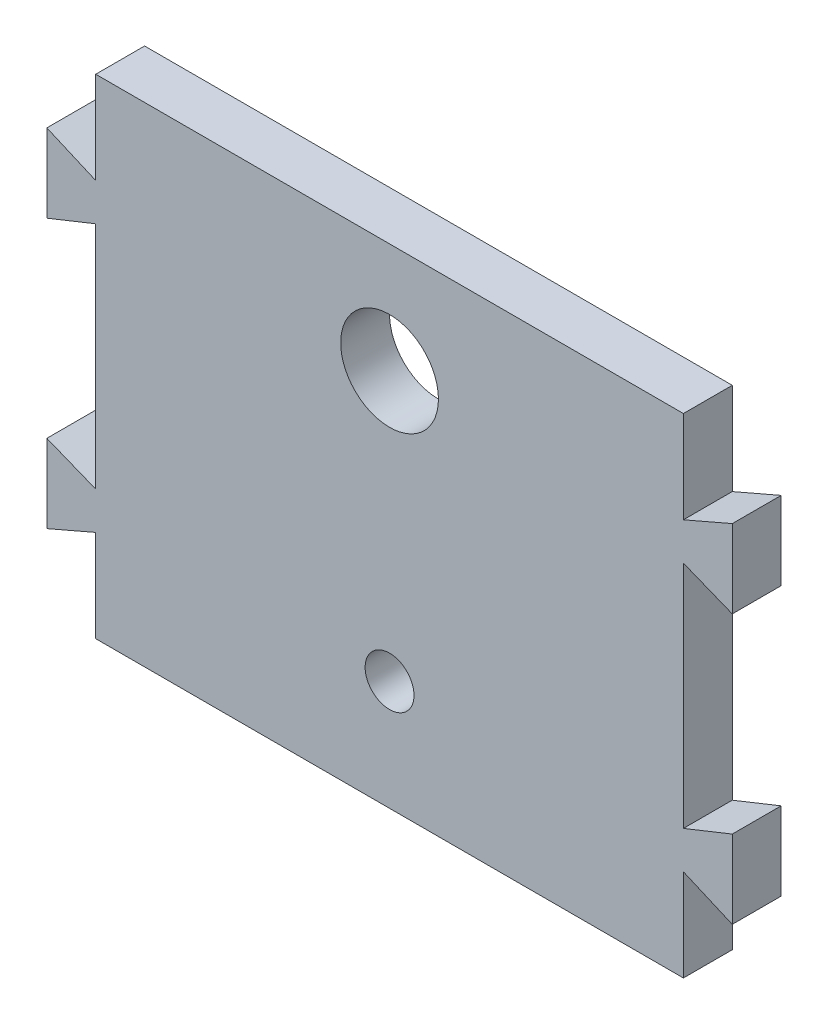
ISO-10303-21;
HEADER;
FILE_DESCRIPTION(('STEP AP214'),'2;1');
FILE_NAME('part.step','',(''),(''),'','','');
FILE_SCHEMA(('AUTOMOTIVE_DESIGN { 1 0 10303 214 1 1 1 1 }'));
ENDSEC;
DATA;
#1=APPLICATION_CONTEXT('core data for automotive mechanical design processes');
#2=APPLICATION_PROTOCOL_DEFINITION('international standard','automotive_design',2000,#1);
#3=PRODUCT_CONTEXT('',#1,'mechanical');
#4=PRODUCT('Part','Part','',(#3));
#5=PRODUCT_RELATED_PRODUCT_CATEGORY('part','',(#4));
#6=PRODUCT_DEFINITION_FORMATION('','',#4);
#7=PRODUCT_DEFINITION_CONTEXT('part definition',#1,'design');
#8=PRODUCT_DEFINITION('design','',#6,#7);
#9=PRODUCT_DEFINITION_SHAPE('','',#8);
#10=(LENGTH_UNIT() NAMED_UNIT(*) SI_UNIT(.MILLI.,.METRE.));
#11=(NAMED_UNIT(*) PLANE_ANGLE_UNIT() SI_UNIT($,.RADIAN.));
#12=(NAMED_UNIT(*) SI_UNIT($,.STERADIAN.) SOLID_ANGLE_UNIT());
#13=UNCERTAINTY_MEASURE_WITH_UNIT(LENGTH_MEASURE(1.E-05),#10,'distance_accuracy_value','');
#14=(GEOMETRIC_REPRESENTATION_CONTEXT(3) GLOBAL_UNCERTAINTY_ASSIGNED_CONTEXT((#13)) GLOBAL_UNIT_ASSIGNED_CONTEXT((#10,
#11,#12)) REPRESENTATION_CONTEXT('',''));
#15=CARTESIAN_POINT('',(0.,0.,0.));
#16=DIRECTION('',(0.,0.,1.));
#17=DIRECTION('',(1.,0.,0.));
#18=AXIS2_PLACEMENT_3D('',#15,#16,#17);
#19=CARTESIAN_POINT('',(0.,0.,3.175));
#20=DIRECTION('',(0.,1.,0.));
#21=DIRECTION('',(0.,0.,1.));
#22=AXIS2_PLACEMENT_3D('',#19,#20,#21);
#23=PLANE('',#22);
#24=DIRECTION('',(1.,0.,0.));
#25=VECTOR('',#24,1.);
#26=CARTESIAN_POINT('',(0.,0.,0.));
#27=LINE('',#26,#25);
#28=CARTESIAN_POINT('',(0.,0.,0.));
#29=VERTEX_POINT('',#28);
#30=CARTESIAN_POINT('',(38.1703169325789,0.,0.));
#31=VERTEX_POINT('',#30);
#32=EDGE_CURVE('E398',#29,#31,#27,.T.);
#33=ORIENTED_EDGE('',*,*,#32,.T.);
#34=DIRECTION('',(0.,0.,-1.));
#35=VECTOR('',#34,1.);
#36=CARTESIAN_POINT('',(38.1703169325789,0.,3.175));
#37=LINE('',#36,#35);
#38=CARTESIAN_POINT('',(38.1703169325789,0.,3.175));
#39=VERTEX_POINT('',#38);
#40=EDGE_CURVE('E282',#39,#31,#37,.T.);
#41=ORIENTED_EDGE('',*,*,#40,.F.);
#42=DIRECTION('',(1.,0.,0.));
#43=VECTOR('',#42,1.);
#44=CARTESIAN_POINT('',(0.,0.,3.175));
#45=LINE('',#44,#43);
#46=CARTESIAN_POINT('',(0.,0.,3.175));
#47=VERTEX_POINT('',#46);
#48=EDGE_CURVE('E384',#47,#39,#45,.T.);
#49=ORIENTED_EDGE('',*,*,#48,.F.);
#50=DIRECTION('',(0.,0.,-1.));
#51=VECTOR('',#50,1.);
#52=CARTESIAN_POINT('',(0.,0.,3.175));
#53=LINE('',#52,#51);
#54=EDGE_CURVE('E273',#47,#29,#53,.T.);
#55=ORIENTED_EDGE('',*,*,#54,.T.);
#56=EDGE_LOOP('',(#33,#41,#49,#55));
#57=FACE_BOUND('',#56,.T.);
#58=ADVANCED_FACE('F147',(#57),#23,.F.);
#59=CARTESIAN_POINT('',(0.,31.751666378509,3.175));
#60=DIRECTION('',(0.,1.,0.));
#61=DIRECTION('',(0.,0.,1.));
#62=AXIS2_PLACEMENT_3D('',#59,#60,#61);
#63=PLANE('',#62);
#64=DIRECTION('',(1.,0.,0.));
#65=VECTOR('',#64,1.);
#66=CARTESIAN_POINT('',(0.,31.751666378509,0.));
#67=LINE('',#66,#65);
#68=CARTESIAN_POINT('',(0.,31.751666378509,0.));
#69=VERTEX_POINT('',#68);
#70=CARTESIAN_POINT('',(38.1703169325789,31.751666378509,0.));
#71=VERTEX_POINT('',#70);
#72=EDGE_CURVE('E315',#69,#71,#67,.T.);
#73=ORIENTED_EDGE('',*,*,#72,.F.);
#74=DIRECTION('',(0.,0.,-1.));
#75=VECTOR('',#74,1.);
#76=CARTESIAN_POINT('',(0.,31.751666378509,3.175));
#77=LINE('',#76,#75);
#78=CARTESIAN_POINT('',(0.,31.751666378509,3.175));
#79=VERTEX_POINT('',#78);
#80=EDGE_CURVE('E269',#79,#69,#77,.T.);
#81=ORIENTED_EDGE('',*,*,#80,.F.);
#82=DIRECTION('',(1.,0.,0.));
#83=VECTOR('',#82,1.);
#84=CARTESIAN_POINT('',(0.,31.751666378509,3.175));
#85=LINE('',#84,#83);
#86=CARTESIAN_POINT('',(38.1703169325789,31.751666378509,3.175));
#87=VERTEX_POINT('',#86);
#88=EDGE_CURVE('E386',#79,#87,#85,.T.);
#89=ORIENTED_EDGE('',*,*,#88,.T.);
#90=DIRECTION('',(0.,0.,-1.));
#91=VECTOR('',#90,1.);
#92=CARTESIAN_POINT('',(38.1703169325789,31.751666378509,3.175));
#93=LINE('',#92,#91);
#94=EDGE_CURVE('E290',#87,#71,#93,.T.);
#95=ORIENTED_EDGE('',*,*,#94,.T.);
#96=EDGE_LOOP('',(#73,#81,#89,#95));
#97=FACE_BOUND('',#96,.T.);
#98=ADVANCED_FACE('F419',(#97),#63,.T.);
#99=CARTESIAN_POINT('',(0.,0.,0.));
#100=DIRECTION('',(0.,0.,-1.));
#101=DIRECTION('',(-1.,0.,0.));
#102=AXIS2_PLACEMENT_3D('',#99,#100,#101);
#103=PLANE('',#102);
#104=CARTESIAN_POINT('',(19.0851584662894,24.6070831892545,0.));
#105=DIRECTION('',(0.,0.,1.));
#106=DIRECTION('',(1.,0.,0.));
#107=AXIS2_PLACEMENT_3D('',#104,#105,#106);
#108=CIRCLE('',#107,3.175);
#109=CARTESIAN_POINT('',(22.2601584662894,24.6070831892545,0.));
#110=VERTEX_POINT('',#109);
#111=EDGE_CURVE('E248',#110,#110,#108,.T.);
#112=ORIENTED_EDGE('',*,*,#111,.T.);
#113=EDGE_LOOP('',(#112));
#114=FACE_BOUND('',#113,.T.);
#115=CARTESIAN_POINT('',(19.0851584662894,7.14458318925448,0.));
#116=DIRECTION('',(0.,0.,1.));
#117=DIRECTION('',(1.,0.,0.));
#118=AXIS2_PLACEMENT_3D('',#115,#116,#117);
#119=CIRCLE('',#118,1.5875);
#120=CARTESIAN_POINT('',(20.6726584662894,7.14458318925448,0.));
#121=VERTEX_POINT('',#120);
#122=EDGE_CURVE('E718',#121,#121,#119,.T.);
#123=ORIENTED_EDGE('',*,*,#122,.T.);
#124=EDGE_LOOP('',(#123));
#125=FACE_BOUND('',#124,.T.);
#126=ORIENTED_EDGE('',*,*,#72,.T.);
#127=DIRECTION('',(0.,-1.,0.));
#128=VECTOR('',#127,1.);
#129=CARTESIAN_POINT('',(38.1703169325789,31.751666378509,0.));
#130=LINE('',#129,#128);
#131=CARTESIAN_POINT('',(38.1703169325789,25.774124793108,0.));
#132=VERTEX_POINT('',#131);
#133=EDGE_CURVE('E247',#71,#132,#130,.T.);
#134=ORIENTED_EDGE('',*,*,#133,.T.);
#135=DIRECTION('',(-0.917858571147631,-0.396907600545555,0.));
#136=VECTOR('',#135,1.);
#137=CARTESIAN_POINT('',(41.3453169325789,27.1470831892545,0.));
#138=LINE('',#137,#136);
#139=CARTESIAN_POINT('',(41.3453169325789,27.1470831892545,0.));
#140=VERTEX_POINT('',#139);
#141=EDGE_CURVE('E239',#140,#132,#138,.T.);
#142=ORIENTED_EDGE('',*,*,#141,.F.);
#143=DIRECTION('',(0.,1.,0.));
#144=VECTOR('',#143,1.);
#145=CARTESIAN_POINT('',(41.3453169325789,24.6070831892545,0.));
#146=LINE('',#145,#144);
#147=CARTESIAN_POINT('',(41.3453169325789,22.0670831892545,0.));
#148=VERTEX_POINT('',#147);
#149=EDGE_CURVE('E221',#148,#140,#146,.T.);
#150=ORIENTED_EDGE('',*,*,#149,.F.);
#151=DIRECTION('',(-0.928476690885259,0.371390676354103,0.));
#152=VECTOR('',#151,1.);
#153=CARTESIAN_POINT('',(41.3453169325789,22.0670831892545,0.));
#154=LINE('',#153,#152);
#155=CARTESIAN_POINT('',(38.1703169325789,23.3370831892545,0.));
#156=VERTEX_POINT('',#155);
#157=EDGE_CURVE('E233',#148,#156,#154,.T.);
#158=ORIENTED_EDGE('',*,*,#157,.T.);
#159=CARTESIAN_POINT('',(38.1703169325789,8.41458318925448,0.));
#160=VERTEX_POINT('',#159);
#161=EDGE_CURVE('E399',#156,#160,#130,.T.);
#162=ORIENTED_EDGE('',*,*,#161,.T.);
#163=DIRECTION('',(-0.928476690885259,-0.371390676354103,0.));
#164=VECTOR('',#163,1.);
#165=CARTESIAN_POINT('',(41.3453169325789,9.68458318925448,0.));
#166=LINE('',#165,#164);
#167=CARTESIAN_POINT('',(41.3453169325789,9.68458318925448,0.));
#168=VERTEX_POINT('',#167);
#169=EDGE_CURVE('E356',#168,#160,#166,.T.);
#170=ORIENTED_EDGE('',*,*,#169,.F.);
#171=DIRECTION('',(0.,-1.,0.));
#172=VECTOR('',#171,1.);
#173=CARTESIAN_POINT('',(41.3453169325789,7.14458318925449,0.));
#174=LINE('',#173,#172);
#175=CARTESIAN_POINT('',(41.3453169325789,4.60458318925448,0.));
#176=VERTEX_POINT('',#175);
#177=EDGE_CURVE('E348',#168,#176,#174,.T.);
#178=ORIENTED_EDGE('',*,*,#177,.T.);
#179=DIRECTION('',(-0.917858571147631,0.396907600545555,0.));
#180=VECTOR('',#179,1.);
#181=CARTESIAN_POINT('',(41.3453169325789,4.60458318925448,0.));
#182=LINE('',#181,#180);
#183=CARTESIAN_POINT('',(38.1703169325789,5.97754158540095,0.));
#184=VERTEX_POINT('',#183);
#185=EDGE_CURVE('E257',#176,#184,#182,.T.);
#186=ORIENTED_EDGE('',*,*,#185,.T.);
#187=EDGE_CURVE('E397',#184,#31,#130,.T.);
#188=ORIENTED_EDGE('',*,*,#187,.T.);
#189=ORIENTED_EDGE('',*,*,#32,.F.);
#190=DIRECTION('',(0.,-1.,0.));
#191=VECTOR('',#190,1.);
#192=CARTESIAN_POINT('',(0.,31.751666378509,0.));
#193=LINE('',#192,#191);
#194=CARTESIAN_POINT('',(0.,5.97754158540095,0.));
#195=VERTEX_POINT('',#194);
#196=EDGE_CURVE('E401',#195,#29,#193,.T.);
#197=ORIENTED_EDGE('',*,*,#196,.F.);
#198=DIRECTION('',(0.91785857114763,0.396907600545555,0.));
#199=VECTOR('',#198,1.);
#200=CARTESIAN_POINT('',(-3.175,4.60458318925448,0.));
#201=LINE('',#200,#199);
#202=CARTESIAN_POINT('',(-3.175,4.60458318925448,0.));
#203=VERTEX_POINT('',#202);
#204=EDGE_CURVE('E333',#203,#195,#201,.T.);
#205=ORIENTED_EDGE('',*,*,#204,.F.);
#206=DIRECTION('',(0.,1.,0.));
#207=VECTOR('',#206,1.);
#208=CARTESIAN_POINT('',(-3.175,7.14458318925449,0.));
#209=LINE('',#208,#207);
#210=CARTESIAN_POINT('',(-3.175,9.68458318925448,0.));
#211=VERTEX_POINT('',#210);
#212=EDGE_CURVE('E325',#203,#211,#209,.T.);
#213=ORIENTED_EDGE('',*,*,#212,.T.);
#214=DIRECTION('',(0.928476690885259,-0.371390676354104,0.));
#215=VECTOR('',#214,1.);
#216=CARTESIAN_POINT('',(-3.175,9.68458318925448,0.));
#217=LINE('',#216,#215);
#218=CARTESIAN_POINT('',(0.,8.41458318925448,0.));
#219=VERTEX_POINT('',#218);
#220=EDGE_CURVE('E330',#211,#219,#217,.T.);
#221=ORIENTED_EDGE('',*,*,#220,.T.);
#222=CARTESIAN_POINT('',(0.,23.3370831892545,0.));
#223=VERTEX_POINT('',#222);
#224=EDGE_CURVE('E407',#223,#219,#193,.T.);
#225=ORIENTED_EDGE('',*,*,#224,.F.);
#226=DIRECTION('',(0.928476690885259,0.371390676354104,0.));
#227=VECTOR('',#226,1.);
#228=CARTESIAN_POINT('',(-3.175,22.0670831892545,0.));
#229=LINE('',#228,#227);
#230=CARTESIAN_POINT('',(-3.175,22.0670831892545,0.));
#231=VERTEX_POINT('',#230);
#232=EDGE_CURVE('E307',#231,#223,#229,.T.);
#233=ORIENTED_EDGE('',*,*,#232,.F.);
#234=DIRECTION('',(0.,1.,0.));
#235=VECTOR('',#234,1.);
#236=CARTESIAN_POINT('',(-3.175,24.6070831892545,0.));
#237=LINE('',#236,#235);
#238=CARTESIAN_POINT('',(-3.175,27.1470831892545,0.));
#239=VERTEX_POINT('',#238);
#240=EDGE_CURVE('E298',#231,#239,#237,.T.);
#241=ORIENTED_EDGE('',*,*,#240,.T.);
#242=DIRECTION('',(0.91785857114763,-0.396907600545555,0.));
#243=VECTOR('',#242,1.);
#244=CARTESIAN_POINT('',(-3.175,27.1470831892545,0.));
#245=LINE('',#244,#243);
#246=CARTESIAN_POINT('',(0.,25.774124793108,0.));
#247=VERTEX_POINT('',#246);
#248=EDGE_CURVE('E304',#239,#247,#245,.T.);
#249=ORIENTED_EDGE('',*,*,#248,.T.);
#250=EDGE_CURVE('E285',#69,#247,#193,.T.);
#251=ORIENTED_EDGE('',*,*,#250,.F.);
#252=EDGE_LOOP('',(#126,#134,#142,#150,#158,#162,#170,#178,#186,#188,#189,#197,#205,#213,#221,
#225,#233,#241,#249,#251));
#253=FACE_BOUND('',#252,.T.);
#254=ADVANCED_FACE('F245',(#114,#125,#253),#103,.T.);
#255=CARTESIAN_POINT('',(0.,0.,3.175));
#256=DIRECTION('',(0.,0.,-1.));
#257=DIRECTION('',(-1.,0.,0.));
#258=AXIS2_PLACEMENT_3D('',#255,#256,#257);
#259=PLANE('',#258);
#260=CARTESIAN_POINT('',(19.0851584662894,24.6070831892545,3.175));
#261=DIRECTION('',(0.,0.,1.));
#262=DIRECTION('',(1.,0.,0.));
#263=AXIS2_PLACEMENT_3D('',#260,#261,#262);
#264=CIRCLE('',#263,3.175);
#265=CARTESIAN_POINT('',(22.2601584662894,24.6070831892545,3.175));
#266=VERTEX_POINT('',#265);
#267=EDGE_CURVE('E252',#266,#266,#264,.T.);
#268=ORIENTED_EDGE('',*,*,#267,.F.);
#269=EDGE_LOOP('',(#268));
#270=FACE_BOUND('',#269,.T.);
#271=CARTESIAN_POINT('',(19.0851584662894,7.14458318925448,3.175));
#272=DIRECTION('',(0.,0.,1.));
#273=DIRECTION('',(1.,0.,0.));
#274=AXIS2_PLACEMENT_3D('',#271,#272,#273);
#275=CIRCLE('',#274,1.5875);
#276=CARTESIAN_POINT('',(20.6726584662894,7.14458318925448,3.175));
#277=VERTEX_POINT('',#276);
#278=EDGE_CURVE('E715',#277,#277,#275,.T.);
#279=ORIENTED_EDGE('',*,*,#278,.F.);
#280=EDGE_LOOP('',(#279));
#281=FACE_BOUND('',#280,.T.);
#282=ORIENTED_EDGE('',*,*,#88,.F.);
#283=DIRECTION('',(0.,-1.,0.));
#284=VECTOR('',#283,1.);
#285=CARTESIAN_POINT('',(0.,31.751666378509,3.175));
#286=LINE('',#285,#284);
#287=CARTESIAN_POINT('',(0.,25.774124793108,3.175));
#288=VERTEX_POINT('',#287);
#289=EDGE_CURVE('E293',#79,#288,#286,.T.);
#290=ORIENTED_EDGE('',*,*,#289,.T.);
#291=DIRECTION('',(0.91785857114763,-0.396907600545555,0.));
#292=VECTOR('',#291,1.);
#293=CARTESIAN_POINT('',(-3.175,27.1470831892545,3.175));
#294=LINE('',#293,#292);
#295=CARTESIAN_POINT('',(-3.175,27.1470831892545,3.175));
#296=VERTEX_POINT('',#295);
#297=EDGE_CURVE('E294',#296,#288,#294,.T.);
#298=ORIENTED_EDGE('',*,*,#297,.F.);
#299=DIRECTION('',(0.,-1.,0.));
#300=VECTOR('',#299,1.);
#301=CARTESIAN_POINT('',(-3.175,24.6070831892545,3.175));
#302=LINE('',#301,#300);
#303=CARTESIAN_POINT('',(-3.175,22.0670831892545,3.175));
#304=VERTEX_POINT('',#303);
#305=EDGE_CURVE('E301',#296,#304,#302,.T.);
#306=ORIENTED_EDGE('',*,*,#305,.T.);
#307=DIRECTION('',(0.928476690885259,0.371390676354104,0.));
#308=VECTOR('',#307,1.);
#309=CARTESIAN_POINT('',(-3.175,22.0670831892545,3.175));
#310=LINE('',#309,#308);
#311=CARTESIAN_POINT('',(0.,23.3370831892545,3.175));
#312=VERTEX_POINT('',#311);
#313=EDGE_CURVE('E297',#304,#312,#310,.T.);
#314=ORIENTED_EDGE('',*,*,#313,.T.);
#315=CARTESIAN_POINT('',(0.,8.41458318925448,3.175));
#316=VERTEX_POINT('',#315);
#317=EDGE_CURVE('E395',#312,#316,#286,.T.);
#318=ORIENTED_EDGE('',*,*,#317,.T.);
#319=DIRECTION('',(0.928476690885259,-0.371390676354104,0.));
#320=VECTOR('',#319,1.);
#321=CARTESIAN_POINT('',(-3.175,9.68458318925448,3.175));
#322=LINE('',#321,#320);
#323=CARTESIAN_POINT('',(-3.175,9.68458318925448,3.175));
#324=VERTEX_POINT('',#323);
#325=EDGE_CURVE('E321',#324,#316,#322,.T.);
#326=ORIENTED_EDGE('',*,*,#325,.F.);
#327=DIRECTION('',(0.,-1.,0.));
#328=VECTOR('',#327,1.);
#329=CARTESIAN_POINT('',(-3.175,7.14458318925449,3.175));
#330=LINE('',#329,#328);
#331=CARTESIAN_POINT('',(-3.175,4.60458318925448,3.175));
#332=VERTEX_POINT('',#331);
#333=EDGE_CURVE('E327',#324,#332,#330,.T.);
#334=ORIENTED_EDGE('',*,*,#333,.T.);
#335=DIRECTION('',(0.91785857114763,0.396907600545555,0.));
#336=VECTOR('',#335,1.);
#337=CARTESIAN_POINT('',(-3.175,4.60458318925448,3.175));
#338=LINE('',#337,#336);
#339=CARTESIAN_POINT('',(0.,5.97754158540095,3.175));
#340=VERTEX_POINT('',#339);
#341=EDGE_CURVE('E324',#332,#340,#338,.T.);
#342=ORIENTED_EDGE('',*,*,#341,.T.);
#343=EDGE_CURVE('E392',#340,#47,#286,.T.);
#344=ORIENTED_EDGE('',*,*,#343,.T.);
#345=ORIENTED_EDGE('',*,*,#48,.T.);
#346=DIRECTION('',(0.,-1.,0.));
#347=VECTOR('',#346,1.);
#348=CARTESIAN_POINT('',(38.1703169325789,31.751666378509,3.175));
#349=LINE('',#348,#347);
#350=CARTESIAN_POINT('',(38.1703169325789,5.97754158540095,3.175));
#351=VERTEX_POINT('',#350);
#352=EDGE_CURVE('E382',#351,#39,#349,.T.);
#353=ORIENTED_EDGE('',*,*,#352,.F.);
#354=DIRECTION('',(-0.917858571147631,0.396907600545555,0.));
#355=VECTOR('',#354,1.);
#356=CARTESIAN_POINT('',(41.3453169325789,4.60458318925448,3.175));
#357=LINE('',#356,#355);
#358=CARTESIAN_POINT('',(41.3453169325789,4.60458318925448,3.175));
#359=VERTEX_POINT('',#358);
#360=EDGE_CURVE('E344',#359,#351,#357,.T.);
#361=ORIENTED_EDGE('',*,*,#360,.F.);
#362=DIRECTION('',(0.,1.,0.));
#363=VECTOR('',#362,1.);
#364=CARTESIAN_POINT('',(41.3453169325789,7.14458318925449,3.175));
#365=LINE('',#364,#363);
#366=CARTESIAN_POINT('',(41.3453169325789,9.68458318925448,3.175));
#367=VERTEX_POINT('',#366);
#368=EDGE_CURVE('E351',#359,#367,#365,.T.);
#369=ORIENTED_EDGE('',*,*,#368,.T.);
#370=DIRECTION('',(-0.928476690885259,-0.371390676354103,0.));
#371=VECTOR('',#370,1.);
#372=CARTESIAN_POINT('',(41.3453169325789,9.68458318925448,3.175));
#373=LINE('',#372,#371);
#374=CARTESIAN_POINT('',(38.1703169325789,8.41458318925448,3.175));
#375=VERTEX_POINT('',#374);
#376=EDGE_CURVE('E347',#367,#375,#373,.T.);
#377=ORIENTED_EDGE('',*,*,#376,.T.);
#378=CARTESIAN_POINT('',(38.1703169325789,23.3370831892545,3.175));
#379=VERTEX_POINT('',#378);
#380=EDGE_CURVE('E376',#379,#375,#349,.T.);
#381=ORIENTED_EDGE('',*,*,#380,.F.);
#382=DIRECTION('',(-0.928476690885259,0.371390676354103,0.));
#383=VECTOR('',#382,1.);
#384=CARTESIAN_POINT('',(41.3453169325789,22.0670831892545,3.175));
#385=LINE('',#384,#383);
#386=CARTESIAN_POINT('',(41.3453169325789,22.0670831892545,3.175));
#387=VERTEX_POINT('',#386);
#388=EDGE_CURVE('E366',#387,#379,#385,.T.);
#389=ORIENTED_EDGE('',*,*,#388,.F.);
#390=DIRECTION('',(0.,-1.,0.));
#391=VECTOR('',#390,1.);
#392=CARTESIAN_POINT('',(41.3453169325789,24.6070831892545,3.175));
#393=LINE('',#392,#391);
#394=CARTESIAN_POINT('',(41.3453169325789,27.1470831892545,3.175));
#395=VERTEX_POINT('',#394);
#396=EDGE_CURVE('E242',#395,#387,#393,.T.);
#397=ORIENTED_EDGE('',*,*,#396,.F.);
#398=DIRECTION('',(-0.917858571147631,-0.396907600545555,0.));
#399=VECTOR('',#398,1.);
#400=CARTESIAN_POINT('',(41.3453169325789,27.1470831892545,3.175));
#401=LINE('',#400,#399);
#402=CARTESIAN_POINT('',(38.1703169325789,25.774124793108,3.175));
#403=VERTEX_POINT('',#402);
#404=EDGE_CURVE('E232',#395,#403,#401,.T.);
#405=ORIENTED_EDGE('',*,*,#404,.T.);
#406=EDGE_CURVE('E381',#87,#403,#349,.T.);
#407=ORIENTED_EDGE('',*,*,#406,.F.);
#408=EDGE_LOOP('',(#282,#290,#298,#306,#314,#318,#326,#334,#342,#344,#345,#353,#361,#369,#377,
#381,#389,#397,#405,#407));
#409=FACE_BOUND('',#408,.T.);
#410=ADVANCED_FACE('F372',(#270,#281,#409),#259,.F.);
#411=CARTESIAN_POINT('',(38.1703169325789,31.751666378509,3.175));
#412=DIRECTION('',(1.,0.,0.));
#413=DIRECTION('',(0.,0.,-1.));
#414=AXIS2_PLACEMENT_3D('',#411,#412,#413);
#415=PLANE('',#414);
#416=ORIENTED_EDGE('',*,*,#406,.T.);
#417=DIRECTION('',(0.,0.,-1.));
#418=VECTOR('',#417,1.);
#419=CARTESIAN_POINT('',(38.1703169325789,25.774124793108,3.175));
#420=LINE('',#419,#418);
#421=EDGE_CURVE('E151',#403,#132,#420,.T.);
#422=ORIENTED_EDGE('',*,*,#421,.T.);
#423=ORIENTED_EDGE('',*,*,#133,.F.);
#424=ORIENTED_EDGE('',*,*,#94,.F.);
#425=EDGE_LOOP('',(#416,#422,#423,#424));
#426=FACE_BOUND('',#425,.T.);
#427=ADVANCED_FACE('F524',(#426),#415,.T.);
#428=ORIENTED_EDGE('',*,*,#380,.T.);
#429=DIRECTION('',(0.,0.,-1.));
#430=VECTOR('',#429,1.);
#431=CARTESIAN_POINT('',(38.1703169325789,8.41458318925448,3.175));
#432=LINE('',#431,#430);
#433=EDGE_CURVE('E260',#375,#160,#432,.T.);
#434=ORIENTED_EDGE('',*,*,#433,.T.);
#435=ORIENTED_EDGE('',*,*,#161,.F.);
#436=DIRECTION('',(0.,0.,-1.));
#437=VECTOR('',#436,1.);
#438=CARTESIAN_POINT('',(38.1703169325789,23.3370831892545,3.175));
#439=LINE('',#438,#437);
#440=EDGE_CURVE('E258',#379,#156,#439,.T.);
#441=ORIENTED_EDGE('',*,*,#440,.F.);
#442=EDGE_LOOP('',(#428,#434,#435,#441));
#443=FACE_BOUND('',#442,.T.);
#444=ADVANCED_FACE('F488',(#443),#415,.T.);
#445=DIRECTION('',(0.,0.,-1.));
#446=VECTOR('',#445,1.);
#447=CARTESIAN_POINT('',(38.1703169325789,5.97754158540095,3.175));
#448=LINE('',#447,#446);
#449=EDGE_CURVE('E266',#351,#184,#448,.T.);
#450=ORIENTED_EDGE('',*,*,#449,.F.);
#451=ORIENTED_EDGE('',*,*,#352,.T.);
#452=ORIENTED_EDGE('',*,*,#40,.T.);
#453=ORIENTED_EDGE('',*,*,#187,.F.);
#454=EDGE_LOOP('',(#450,#451,#452,#453));
#455=FACE_BOUND('',#454,.T.);
#456=ADVANCED_FACE('F474',(#455),#415,.T.);
#457=CARTESIAN_POINT('',(0.,31.751666378509,3.175));
#458=DIRECTION('',(1.,0.,0.));
#459=DIRECTION('',(0.,0.,-1.));
#460=AXIS2_PLACEMENT_3D('',#457,#458,#459);
#461=PLANE('',#460);
#462=ORIENTED_EDGE('',*,*,#343,.F.);
#463=DIRECTION('',(0.,0.,-1.));
#464=VECTOR('',#463,1.);
#465=CARTESIAN_POINT('',(0.,5.97754158540095,3.175));
#466=LINE('',#465,#464);
#467=EDGE_CURVE('E166',#340,#195,#466,.T.);
#468=ORIENTED_EDGE('',*,*,#467,.T.);
#469=ORIENTED_EDGE('',*,*,#196,.T.);
#470=ORIENTED_EDGE('',*,*,#54,.F.);
#471=EDGE_LOOP('',(#462,#468,#469,#470));
#472=FACE_BOUND('',#471,.T.);
#473=ADVANCED_FACE('F471',(#472),#461,.F.);
#474=ORIENTED_EDGE('',*,*,#317,.F.);
#475=DIRECTION('',(0.,0.,-1.));
#476=VECTOR('',#475,1.);
#477=CARTESIAN_POINT('',(0.,23.3370831892545,3.175));
#478=LINE('',#477,#476);
#479=EDGE_CURVE('E157',#312,#223,#478,.T.);
#480=ORIENTED_EDGE('',*,*,#479,.T.);
#481=ORIENTED_EDGE('',*,*,#224,.T.);
#482=DIRECTION('',(0.,0.,-1.));
#483=VECTOR('',#482,1.);
#484=CARTESIAN_POINT('',(0.,8.41458318925448,3.175));
#485=LINE('',#484,#483);
#486=EDGE_CURVE('E319',#316,#219,#485,.T.);
#487=ORIENTED_EDGE('',*,*,#486,.F.);
#488=EDGE_LOOP('',(#474,#480,#481,#487));
#489=FACE_BOUND('',#488,.T.);
#490=ADVANCED_FACE('F467',(#489),#461,.F.);
#491=DIRECTION('',(0.,0.,-1.));
#492=VECTOR('',#491,1.);
#493=CARTESIAN_POINT('',(0.,25.774124793108,3.175));
#494=LINE('',#493,#492);
#495=EDGE_CURVE('E12',#288,#247,#494,.T.);
#496=ORIENTED_EDGE('',*,*,#495,.F.);
#497=ORIENTED_EDGE('',*,*,#289,.F.);
#498=ORIENTED_EDGE('',*,*,#80,.T.);
#499=ORIENTED_EDGE('',*,*,#250,.T.);
#500=EDGE_LOOP('',(#496,#497,#498,#499));
#501=FACE_BOUND('',#500,.T.);
#502=ADVANCED_FACE('F504',(#501),#461,.F.);
#503=CARTESIAN_POINT('',(41.3453169325789,24.6070831892545,3.175));
#504=DIRECTION('',(-1.,0.,0.));
#505=DIRECTION('',(0.,0.,1.));
#506=AXIS2_PLACEMENT_3D('',#503,#504,#505);
#507=PLANE('',#506);
#508=ORIENTED_EDGE('',*,*,#149,.T.);
#509=DIRECTION('',(0.,0.,-1.));
#510=VECTOR('',#509,1.);
#511=CARTESIAN_POINT('',(41.3453169325789,27.1470831892545,3.175));
#512=LINE('',#511,#510);
#513=EDGE_CURVE('E228',#395,#140,#512,.T.);
#514=ORIENTED_EDGE('',*,*,#513,.F.);
#515=ORIENTED_EDGE('',*,*,#396,.T.);
#516=DIRECTION('',(0.,0.,-1.));
#517=VECTOR('',#516,1.);
#518=CARTESIAN_POINT('',(41.3453169325789,22.0670831892545,3.175));
#519=LINE('',#518,#517);
#520=EDGE_CURVE('E230',#387,#148,#519,.T.);
#521=ORIENTED_EDGE('',*,*,#520,.T.);
#522=EDGE_LOOP('',(#508,#514,#515,#521));
#523=FACE_BOUND('',#522,.T.);
#524=ADVANCED_FACE('F226',(#523),#507,.F.);
#525=CARTESIAN_POINT('',(41.3453169325789,27.1470831892545,3.175));
#526=DIRECTION('',(0.396907600545555,-0.917858571147631,0.));
#527=DIRECTION('',(0.917858571147631,0.396907600545555,0.));
#528=AXIS2_PLACEMENT_3D('',#525,#526,#527);
#529=PLANE('',#528);
#530=ORIENTED_EDGE('',*,*,#141,.T.);
#531=ORIENTED_EDGE('',*,*,#421,.F.);
#532=ORIENTED_EDGE('',*,*,#404,.F.);
#533=ORIENTED_EDGE('',*,*,#513,.T.);
#534=EDGE_LOOP('',(#530,#531,#532,#533));
#535=FACE_BOUND('',#534,.T.);
#536=ADVANCED_FACE('F149',(#535),#529,.F.);
#537=CARTESIAN_POINT('',(41.3453169325789,22.0670831892545,3.175));
#538=DIRECTION('',(-0.371390676354103,-0.928476690885259,0.));
#539=DIRECTION('',(0.92847669088526,-0.371390676354103,0.));
#540=AXIS2_PLACEMENT_3D('',#537,#538,#539);
#541=PLANE('',#540);
#542=ORIENTED_EDGE('',*,*,#157,.F.);
#543=ORIENTED_EDGE('',*,*,#520,.F.);
#544=ORIENTED_EDGE('',*,*,#388,.T.);
#545=ORIENTED_EDGE('',*,*,#440,.T.);
#546=EDGE_LOOP('',(#542,#543,#544,#545));
#547=FACE_BOUND('',#546,.T.);
#548=ADVANCED_FACE('F512',(#547),#541,.T.);
#549=CARTESIAN_POINT('',(41.3453169325789,7.14458318925449,3.175));
#550=DIRECTION('',(1.,0.,0.));
#551=DIRECTION('',(0.,0.,-1.));
#552=AXIS2_PLACEMENT_3D('',#549,#550,#551);
#553=PLANE('',#552);
#554=ORIENTED_EDGE('',*,*,#177,.F.);
#555=DIRECTION('',(0.,0.,-1.));
#556=VECTOR('',#555,1.);
#557=CARTESIAN_POINT('',(41.3453169325789,9.68458318925448,3.175));
#558=LINE('',#557,#556);
#559=EDGE_CURVE('E353',#367,#168,#558,.T.);
#560=ORIENTED_EDGE('',*,*,#559,.F.);
#561=ORIENTED_EDGE('',*,*,#368,.F.);
#562=DIRECTION('',(0.,0.,-1.));
#563=VECTOR('',#562,1.);
#564=CARTESIAN_POINT('',(41.3453169325789,4.60458318925448,3.175));
#565=LINE('',#564,#563);
#566=EDGE_CURVE('E334',#359,#176,#565,.T.);
#567=ORIENTED_EDGE('',*,*,#566,.T.);
#568=EDGE_LOOP('',(#554,#560,#561,#567));
#569=FACE_BOUND('',#568,.T.);
#570=ADVANCED_FACE('F482',(#569),#553,.T.);
#571=CARTESIAN_POINT('',(41.3453169325789,9.68458318925448,3.175));
#572=DIRECTION('',(0.371390676354103,-0.928476690885259,0.));
#573=DIRECTION('',(0.92847669088526,0.371390676354103,0.));
#574=AXIS2_PLACEMENT_3D('',#571,#572,#573);
#575=PLANE('',#574);
#576=ORIENTED_EDGE('',*,*,#169,.T.);
#577=ORIENTED_EDGE('',*,*,#433,.F.);
#578=ORIENTED_EDGE('',*,*,#376,.F.);
#579=ORIENTED_EDGE('',*,*,#559,.T.);
#580=EDGE_LOOP('',(#576,#577,#578,#579));
#581=FACE_BOUND('',#580,.T.);
#582=ADVANCED_FACE('F485',(#581),#575,.F.);
#583=CARTESIAN_POINT('',(41.3453169325789,4.60458318925448,3.175));
#584=DIRECTION('',(-0.396907600545555,-0.917858571147631,0.));
#585=DIRECTION('',(0.917858571147631,-0.396907600545555,0.));
#586=AXIS2_PLACEMENT_3D('',#583,#584,#585);
#587=PLANE('',#586);
#588=ORIENTED_EDGE('',*,*,#185,.F.);
#589=ORIENTED_EDGE('',*,*,#566,.F.);
#590=ORIENTED_EDGE('',*,*,#360,.T.);
#591=ORIENTED_EDGE('',*,*,#449,.T.);
#592=EDGE_LOOP('',(#588,#589,#590,#591));
#593=FACE_BOUND('',#592,.T.);
#594=ADVANCED_FACE('F480',(#593),#587,.T.);
#595=CARTESIAN_POINT('',(-3.175,7.14458318925449,3.175));
#596=DIRECTION('',(-1.,0.,0.));
#597=DIRECTION('',(0.,-1.,0.));
#598=AXIS2_PLACEMENT_3D('',#595,#596,#597);
#599=PLANE('',#598);
#600=ORIENTED_EDGE('',*,*,#212,.F.);
#601=DIRECTION('',(0.,0.,-1.));
#602=VECTOR('',#601,1.);
#603=CARTESIAN_POINT('',(-3.175,4.60458318925448,3.175));
#604=LINE('',#603,#602);
#605=EDGE_CURVE('E329',#332,#203,#604,.T.);
#606=ORIENTED_EDGE('',*,*,#605,.F.);
#607=ORIENTED_EDGE('',*,*,#333,.F.);
#608=DIRECTION('',(0.,0.,-1.));
#609=VECTOR('',#608,1.);
#610=CARTESIAN_POINT('',(-3.175,9.68458318925448,3.175));
#611=LINE('',#610,#609);
#612=EDGE_CURVE('E308',#324,#211,#611,.T.);
#613=ORIENTED_EDGE('',*,*,#612,.T.);
#614=EDGE_LOOP('',(#600,#606,#607,#613));
#615=FACE_BOUND('',#614,.T.);
#616=ADVANCED_FACE('F493',(#615),#599,.T.);
#617=CARTESIAN_POINT('',(-3.175,4.60458318925448,3.175));
#618=DIRECTION('',(-0.396907600545555,0.91785857114763,0.));
#619=DIRECTION('',(-0.917858571147631,-0.396907600545555,0.));
#620=AXIS2_PLACEMENT_3D('',#617,#618,#619);
#621=PLANE('',#620);
#622=ORIENTED_EDGE('',*,*,#204,.T.);
#623=ORIENTED_EDGE('',*,*,#467,.F.);
#624=ORIENTED_EDGE('',*,*,#341,.F.);
#625=ORIENTED_EDGE('',*,*,#605,.T.);
#626=EDGE_LOOP('',(#622,#623,#624,#625));
#627=FACE_BOUND('',#626,.T.);
#628=ADVANCED_FACE('F490',(#627),#621,.F.);
#629=CARTESIAN_POINT('',(-3.175,9.68458318925448,3.175));
#630=DIRECTION('',(0.371390676354104,0.928476690885259,0.));
#631=DIRECTION('',(-0.928476690885259,0.371390676354104,0.));
#632=AXIS2_PLACEMENT_3D('',#629,#630,#631);
#633=PLANE('',#632);
#634=ORIENTED_EDGE('',*,*,#220,.F.);
#635=ORIENTED_EDGE('',*,*,#612,.F.);
#636=ORIENTED_EDGE('',*,*,#325,.T.);
#637=ORIENTED_EDGE('',*,*,#486,.T.);
#638=EDGE_LOOP('',(#634,#635,#636,#637));
#639=FACE_BOUND('',#638,.T.);
#640=ADVANCED_FACE('F497',(#639),#633,.T.);
#641=CARTESIAN_POINT('',(-3.175,24.6070831892545,3.175));
#642=DIRECTION('',(-1.,0.,0.));
#643=DIRECTION('',(0.,0.,1.));
#644=AXIS2_PLACEMENT_3D('',#641,#642,#643);
#645=PLANE('',#644);
#646=ORIENTED_EDGE('',*,*,#240,.F.);
#647=DIRECTION('',(0.,0.,-1.));
#648=VECTOR('',#647,1.);
#649=CARTESIAN_POINT('',(-3.175,22.0670831892545,3.175));
#650=LINE('',#649,#648);
#651=EDGE_CURVE('E303',#304,#231,#650,.T.);
#652=ORIENTED_EDGE('',*,*,#651,.F.);
#653=ORIENTED_EDGE('',*,*,#305,.F.);
#654=DIRECTION('',(0.,0.,-1.));
#655=VECTOR('',#654,1.);
#656=CARTESIAN_POINT('',(-3.175,27.1470831892545,3.175));
#657=LINE('',#656,#655);
#658=EDGE_CURVE('E313',#296,#239,#657,.T.);
#659=ORIENTED_EDGE('',*,*,#658,.T.);
#660=EDGE_LOOP('',(#646,#652,#653,#659));
#661=FACE_BOUND('',#660,.T.);
#662=ADVANCED_FACE('F500',(#661),#645,.T.);
#663=CARTESIAN_POINT('',(-3.175,22.0670831892545,3.175));
#664=DIRECTION('',(-0.371390676354104,0.928476690885259,0.));
#665=DIRECTION('',(-0.928476690885259,-0.371390676354104,0.));
#666=AXIS2_PLACEMENT_3D('',#663,#664,#665);
#667=PLANE('',#666);
#668=ORIENTED_EDGE('',*,*,#232,.T.);
#669=ORIENTED_EDGE('',*,*,#479,.F.);
#670=ORIENTED_EDGE('',*,*,#313,.F.);
#671=ORIENTED_EDGE('',*,*,#651,.T.);
#672=EDGE_LOOP('',(#668,#669,#670,#671));
#673=FACE_BOUND('',#672,.T.);
#674=ADVANCED_FACE('F459',(#673),#667,.F.);
#675=CARTESIAN_POINT('',(-3.175,27.1470831892545,3.175));
#676=DIRECTION('',(0.396907600545555,0.91785857114763,0.));
#677=DIRECTION('',(-0.917858571147631,0.396907600545555,0.));
#678=AXIS2_PLACEMENT_3D('',#675,#676,#677);
#679=PLANE('',#678);
#680=ORIENTED_EDGE('',*,*,#248,.F.);
#681=ORIENTED_EDGE('',*,*,#658,.F.);
#682=ORIENTED_EDGE('',*,*,#297,.T.);
#683=ORIENTED_EDGE('',*,*,#495,.T.);
#684=EDGE_LOOP('',(#680,#681,#682,#683));
#685=FACE_BOUND('',#684,.T.);
#686=ADVANCED_FACE('F503',(#685),#679,.T.);
#687=CARTESIAN_POINT('',(19.0851584662894,7.14458318925448,0.));
#688=DIRECTION('',(0.,0.,1.));
#689=DIRECTION('',(1.,0.,0.));
#690=AXIS2_PLACEMENT_3D('',#687,#688,#689);
#691=CYLINDRICAL_SURFACE('',#690,1.5875);
#692=ORIENTED_EDGE('',*,*,#122,.F.);
#693=EDGE_LOOP('',(#692));
#694=FACE_BOUND('',#693,.T.);
#695=ORIENTED_EDGE('',*,*,#278,.T.);
#696=EDGE_LOOP('',(#695));
#697=FACE_BOUND('',#696,.T.);
#698=ADVANCED_FACE('F530',(#694,#697),#691,.F.);
#699=CARTESIAN_POINT('',(19.0851584662894,24.6070831892545,0.));
#700=DIRECTION('',(0.,0.,1.));
#701=DIRECTION('',(1.,0.,0.));
#702=AXIS2_PLACEMENT_3D('',#699,#700,#701);
#703=CYLINDRICAL_SURFACE('',#702,3.175);
#704=ORIENTED_EDGE('',*,*,#111,.F.);
#705=EDGE_LOOP('',(#704));
#706=FACE_BOUND('',#705,.T.);
#707=ORIENTED_EDGE('',*,*,#267,.T.);
#708=EDGE_LOOP('',(#707));
#709=FACE_BOUND('',#708,.T.);
#710=ADVANCED_FACE('F618',(#706,#709),#703,.F.);
#711=CLOSED_SHELL('',(#58,#98,#254,#410,#427,#444,#456,#473,#490,#502,#524,#536,#548,#570,#582,
#594,#616,#628,#640,#662,#674,#686,#698,#710));
#712=MANIFOLD_SOLID_BREP('B2',#711);
#713=ADVANCED_BREP_SHAPE_REPRESENTATION('',(#18,#712),#14);
#714=SHAPE_DEFINITION_REPRESENTATION(#9,#713);
ENDSEC;
END-ISO-10303-21;
